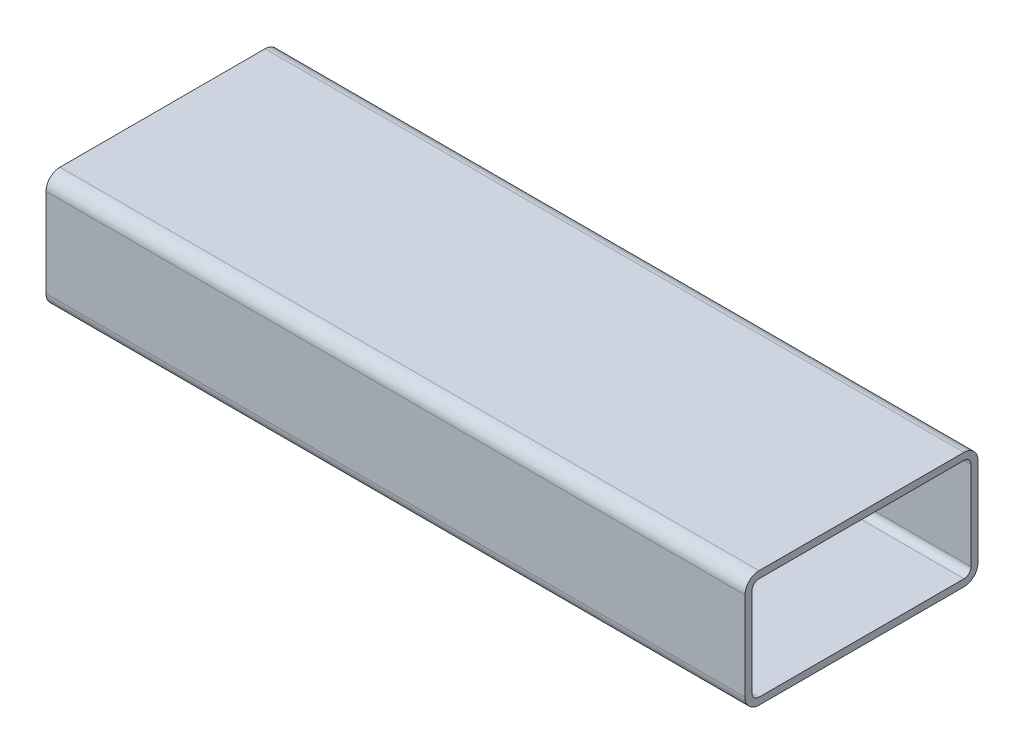
ISO-10303-21;
HEADER;
FILE_DESCRIPTION(('STEP AP214'),'2;1');
FILE_NAME('part.step','',(''),(''),'','','');
FILE_SCHEMA(('AUTOMOTIVE_DESIGN { 1 0 10303 214 1 1 1 1 }'));
ENDSEC;
DATA;
#1=APPLICATION_CONTEXT('core data for automotive mechanical design processes');
#2=APPLICATION_PROTOCOL_DEFINITION('international standard','automotive_design',2000,#1);
#3=PRODUCT_CONTEXT('',#1,'mechanical');
#4=PRODUCT('Part','Part','',(#3));
#5=PRODUCT_RELATED_PRODUCT_CATEGORY('part','',(#4));
#6=PRODUCT_DEFINITION_FORMATION('','',#4);
#7=PRODUCT_DEFINITION_CONTEXT('part definition',#1,'design');
#8=PRODUCT_DEFINITION('design','',#6,#7);
#9=PRODUCT_DEFINITION_SHAPE('','',#8);
#10=(LENGTH_UNIT() NAMED_UNIT(*) SI_UNIT(.MILLI.,.METRE.));
#11=(NAMED_UNIT(*) PLANE_ANGLE_UNIT() SI_UNIT($,.RADIAN.));
#12=(NAMED_UNIT(*) SI_UNIT($,.STERADIAN.) SOLID_ANGLE_UNIT());
#13=UNCERTAINTY_MEASURE_WITH_UNIT(LENGTH_MEASURE(1.E-05),#10,'distance_accuracy_value','');
#14=(GEOMETRIC_REPRESENTATION_CONTEXT(3) GLOBAL_UNCERTAINTY_ASSIGNED_CONTEXT((#13)) GLOBAL_UNIT_ASSIGNED_CONTEXT((#10,
#11,#12)) REPRESENTATION_CONTEXT('',''));
#15=CARTESIAN_POINT('',(0.,0.,0.));
#16=DIRECTION('',(0.,0.,1.));
#17=DIRECTION('',(1.,0.,0.));
#18=AXIS2_PLACEMENT_3D('',#15,#16,#17);
#19=CARTESIAN_POINT('',(152.4,9.652,-22.352));
#20=DIRECTION('',(-1.,0.,0.));
#21=DIRECTION('',(0.,0.,1.));
#22=AXIS2_PLACEMENT_3D('',#19,#20,#21);
#23=CYLINDRICAL_SURFACE('',#22,3.048);
#24=CARTESIAN_POINT('',(0.,9.652,-22.352));
#25=DIRECTION('',(1.,0.,0.));
#26=DIRECTION('',(0.,0.,-1.));
#27=AXIS2_PLACEMENT_3D('',#24,#25,#26);
#28=CIRCLE('',#27,3.048);
#29=CARTESIAN_POINT('',(0.,9.65199999999999,-25.4));
#30=VERTEX_POINT('',#29);
#31=CARTESIAN_POINT('',(0.,12.7,-22.352));
#32=VERTEX_POINT('',#31);
#33=EDGE_CURVE('E11',#30,#32,#28,.T.);
#34=ORIENTED_EDGE('',*,*,#33,.T.);
#35=DIRECTION('',(-1.,0.,0.));
#36=VECTOR('',#35,1.);
#37=CARTESIAN_POINT('',(152.4,12.7,-22.352));
#38=LINE('',#37,#36);
#39=CARTESIAN_POINT('',(152.4,12.7,-22.352));
#40=VERTEX_POINT('',#39);
#41=EDGE_CURVE('E40',#40,#32,#38,.T.);
#42=ORIENTED_EDGE('',*,*,#41,.F.);
#43=CARTESIAN_POINT('',(152.4,9.652,-22.352));
#44=DIRECTION('',(1.,0.,0.));
#45=DIRECTION('',(0.,0.,-1.));
#46=AXIS2_PLACEMENT_3D('',#43,#44,#45);
#47=CIRCLE('',#46,3.048);
#48=CARTESIAN_POINT('',(152.4,9.65199999999999,-25.4));
#49=VERTEX_POINT('',#48);
#50=EDGE_CURVE('E403',#49,#40,#47,.T.);
#51=ORIENTED_EDGE('',*,*,#50,.F.);
#52=DIRECTION('',(-1.,0.,0.));
#53=VECTOR('',#52,1.);
#54=CARTESIAN_POINT('',(152.4,9.65199999999999,-25.4));
#55=LINE('',#54,#53);
#56=EDGE_CURVE('E31',#49,#30,#55,.T.);
#57=ORIENTED_EDGE('',*,*,#56,.T.);
#58=EDGE_LOOP('',(#34,#42,#51,#57));
#59=FACE_BOUND('',#58,.T.);
#60=ADVANCED_FACE('F19',(#59),#23,.T.);
#61=CARTESIAN_POINT('',(152.4,12.7,22.352));
#62=DIRECTION('',(0.,-1.,0.));
#63=DIRECTION('',(0.,0.,-1.));
#64=AXIS2_PLACEMENT_3D('',#61,#62,#63);
#65=PLANE('',#64);
#66=DIRECTION('',(0.,0.,1.));
#67=VECTOR('',#66,1.);
#68=CARTESIAN_POINT('',(0.,12.7,22.352));
#69=LINE('',#68,#67);
#70=CARTESIAN_POINT('',(0.,12.7,22.352));
#71=VERTEX_POINT('',#70);
#72=EDGE_CURVE('E472',#32,#71,#69,.T.);
#73=ORIENTED_EDGE('',*,*,#72,.T.);
#74=DIRECTION('',(-1.,0.,0.));
#75=VECTOR('',#74,1.);
#76=CARTESIAN_POINT('',(152.4,12.7,22.352));
#77=LINE('',#76,#75);
#78=CARTESIAN_POINT('',(152.4,12.7,22.352));
#79=VERTEX_POINT('',#78);
#80=EDGE_CURVE('E404',#79,#71,#77,.T.);
#81=ORIENTED_EDGE('',*,*,#80,.F.);
#82=DIRECTION('',(0.,0.,1.));
#83=VECTOR('',#82,1.);
#84=CARTESIAN_POINT('',(152.4,12.7,22.352));
#85=LINE('',#84,#83);
#86=EDGE_CURVE('E388',#40,#79,#85,.T.);
#87=ORIENTED_EDGE('',*,*,#86,.F.);
#88=ORIENTED_EDGE('',*,*,#41,.T.);
#89=EDGE_LOOP('',(#73,#81,#87,#88));
#90=FACE_BOUND('',#89,.T.);
#91=ADVANCED_FACE('F550',(#90),#65,.F.);
#92=CARTESIAN_POINT('',(152.4,9.652,22.352));
#93=DIRECTION('',(-1.,0.,0.));
#94=DIRECTION('',(0.,0.,1.));
#95=AXIS2_PLACEMENT_3D('',#92,#93,#94);
#96=CYLINDRICAL_SURFACE('',#95,3.048);
#97=CARTESIAN_POINT('',(0.,9.652,22.352));
#98=DIRECTION('',(1.,0.,0.));
#99=DIRECTION('',(0.,0.,-1.));
#100=AXIS2_PLACEMENT_3D('',#97,#98,#99);
#101=CIRCLE('',#100,3.048);
#102=CARTESIAN_POINT('',(0.,9.65199999999999,25.4));
#103=VERTEX_POINT('',#102);
#104=EDGE_CURVE('E407',#71,#103,#101,.T.);
#105=ORIENTED_EDGE('',*,*,#104,.T.);
#106=DIRECTION('',(-1.,0.,0.));
#107=VECTOR('',#106,1.);
#108=CARTESIAN_POINT('',(152.4,9.65199999999999,25.4));
#109=LINE('',#108,#107);
#110=CARTESIAN_POINT('',(152.4,9.65199999999999,25.4));
#111=VERTEX_POINT('',#110);
#112=EDGE_CURVE('E389',#111,#103,#109,.T.);
#113=ORIENTED_EDGE('',*,*,#112,.F.);
#114=CARTESIAN_POINT('',(152.4,9.652,22.352));
#115=DIRECTION('',(1.,0.,0.));
#116=DIRECTION('',(0.,0.,-1.));
#117=AXIS2_PLACEMENT_3D('',#114,#115,#116);
#118=CIRCLE('',#117,3.048);
#119=EDGE_CURVE('E373',#79,#111,#118,.T.);
#120=ORIENTED_EDGE('',*,*,#119,.F.);
#121=ORIENTED_EDGE('',*,*,#80,.T.);
#122=EDGE_LOOP('',(#105,#113,#120,#121));
#123=FACE_BOUND('',#122,.T.);
#124=ADVANCED_FACE('F547',(#123),#96,.T.);
#125=CARTESIAN_POINT('',(152.4,9.65199999999999,25.4));
#126=DIRECTION('',(0.,0.,-1.));
#127=DIRECTION('',(0.,1.,0.));
#128=AXIS2_PLACEMENT_3D('',#125,#126,#127);
#129=PLANE('',#128);
#130=DIRECTION('',(0.,-1.,0.));
#131=VECTOR('',#130,1.);
#132=CARTESIAN_POINT('',(0.,9.65199999999999,25.4));
#133=LINE('',#132,#131);
#134=CARTESIAN_POINT('',(0.,-9.652,25.4));
#135=VERTEX_POINT('',#134);
#136=EDGE_CURVE('E391',#103,#135,#133,.T.);
#137=ORIENTED_EDGE('',*,*,#136,.T.);
#138=DIRECTION('',(-1.,0.,0.));
#139=VECTOR('',#138,1.);
#140=CARTESIAN_POINT('',(152.4,-9.652,25.4));
#141=LINE('',#140,#139);
#142=CARTESIAN_POINT('',(152.4,-9.652,25.4));
#143=VERTEX_POINT('',#142);
#144=EDGE_CURVE('E374',#143,#135,#141,.T.);
#145=ORIENTED_EDGE('',*,*,#144,.F.);
#146=DIRECTION('',(0.,-1.,0.));
#147=VECTOR('',#146,1.);
#148=CARTESIAN_POINT('',(152.4,9.65199999999999,25.4));
#149=LINE('',#148,#147);
#150=EDGE_CURVE('E357',#111,#143,#149,.T.);
#151=ORIENTED_EDGE('',*,*,#150,.F.);
#152=ORIENTED_EDGE('',*,*,#112,.T.);
#153=EDGE_LOOP('',(#137,#145,#151,#152));
#154=FACE_BOUND('',#153,.T.);
#155=ADVANCED_FACE('F539',(#154),#129,.F.);
#156=CARTESIAN_POINT('',(152.4,-9.652,22.352));
#157=DIRECTION('',(-1.,0.,0.));
#158=DIRECTION('',(0.,0.,1.));
#159=AXIS2_PLACEMENT_3D('',#156,#157,#158);
#160=CYLINDRICAL_SURFACE('',#159,3.048);
#161=CARTESIAN_POINT('',(0.,-9.652,22.352));
#162=DIRECTION('',(1.,0.,0.));
#163=DIRECTION('',(0.,0.,1.));
#164=AXIS2_PLACEMENT_3D('',#161,#162,#163);
#165=CIRCLE('',#164,3.048);
#166=CARTESIAN_POINT('',(0.,-12.7,22.352));
#167=VERTEX_POINT('',#166);
#168=EDGE_CURVE('E376',#135,#167,#165,.T.);
#169=ORIENTED_EDGE('',*,*,#168,.T.);
#170=DIRECTION('',(-1.,0.,0.));
#171=VECTOR('',#170,1.);
#172=CARTESIAN_POINT('',(152.4,-12.7,22.352));
#173=LINE('',#172,#171);
#174=CARTESIAN_POINT('',(152.4,-12.7,22.352));
#175=VERTEX_POINT('',#174);
#176=EDGE_CURVE('E358',#175,#167,#173,.T.);
#177=ORIENTED_EDGE('',*,*,#176,.F.);
#178=CARTESIAN_POINT('',(152.4,-9.652,22.352));
#179=DIRECTION('',(1.,0.,0.));
#180=DIRECTION('',(0.,0.,1.));
#181=AXIS2_PLACEMENT_3D('',#178,#179,#180);
#182=CIRCLE('',#181,3.048);
#183=EDGE_CURVE('E338',#143,#175,#182,.T.);
#184=ORIENTED_EDGE('',*,*,#183,.F.);
#185=ORIENTED_EDGE('',*,*,#144,.T.);
#186=EDGE_LOOP('',(#169,#177,#184,#185));
#187=FACE_BOUND('',#186,.T.);
#188=ADVANCED_FACE('F537',(#187),#160,.T.);
#189=CARTESIAN_POINT('',(152.4,-12.7,22.352));
#190=DIRECTION('',(0.,1.,0.));
#191=DIRECTION('',(0.,0.,1.));
#192=AXIS2_PLACEMENT_3D('',#189,#190,#191);
#193=PLANE('',#192);
#194=DIRECTION('',(0.,0.,-1.));
#195=VECTOR('',#194,1.);
#196=CARTESIAN_POINT('',(0.,-12.7,22.352));
#197=LINE('',#196,#195);
#198=CARTESIAN_POINT('',(0.,-12.7,-22.352));
#199=VERTEX_POINT('',#198);
#200=EDGE_CURVE('E360',#167,#199,#197,.T.);
#201=ORIENTED_EDGE('',*,*,#200,.T.);
#202=DIRECTION('',(-1.,0.,0.));
#203=VECTOR('',#202,1.);
#204=CARTESIAN_POINT('',(152.4,-12.7,-22.352));
#205=LINE('',#204,#203);
#206=CARTESIAN_POINT('',(152.4,-12.7,-22.352));
#207=VERTEX_POINT('',#206);
#208=EDGE_CURVE('E293',#207,#199,#205,.T.);
#209=ORIENTED_EDGE('',*,*,#208,.F.);
#210=DIRECTION('',(0.,0.,-1.));
#211=VECTOR('',#210,1.);
#212=CARTESIAN_POINT('',(152.4,-12.7,22.352));
#213=LINE('',#212,#211);
#214=EDGE_CURVE('E307',#175,#207,#213,.T.);
#215=ORIENTED_EDGE('',*,*,#214,.F.);
#216=ORIENTED_EDGE('',*,*,#176,.T.);
#217=EDGE_LOOP('',(#201,#209,#215,#216));
#218=FACE_BOUND('',#217,.T.);
#219=ADVANCED_FACE('F535',(#218),#193,.F.);
#220=CARTESIAN_POINT('',(152.4,-9.652,-22.352));
#221=DIRECTION('',(-1.,0.,0.));
#222=DIRECTION('',(0.,0.,1.));
#223=AXIS2_PLACEMENT_3D('',#220,#221,#222);
#224=CYLINDRICAL_SURFACE('',#223,3.048);
#225=CARTESIAN_POINT('',(0.,-9.652,-22.352));
#226=DIRECTION('',(1.,0.,0.));
#227=DIRECTION('',(0.,0.,-1.));
#228=AXIS2_PLACEMENT_3D('',#225,#226,#227);
#229=CIRCLE('',#228,3.048);
#230=CARTESIAN_POINT('',(0.,-9.65199999999999,-25.4));
#231=VERTEX_POINT('',#230);
#232=EDGE_CURVE('E341',#199,#231,#229,.T.);
#233=ORIENTED_EDGE('',*,*,#232,.T.);
#234=DIRECTION('',(-1.,0.,0.));
#235=VECTOR('',#234,1.);
#236=CARTESIAN_POINT('',(152.4,-9.65199999999999,-25.4));
#237=LINE('',#236,#235);
#238=CARTESIAN_POINT('',(152.4,-9.65199999999999,-25.4));
#239=VERTEX_POINT('',#238);
#240=EDGE_CURVE('E308',#239,#231,#237,.T.);
#241=ORIENTED_EDGE('',*,*,#240,.F.);
#242=CARTESIAN_POINT('',(152.4,-9.652,-22.352));
#243=DIRECTION('',(1.,0.,0.));
#244=DIRECTION('',(0.,0.,-1.));
#245=AXIS2_PLACEMENT_3D('',#242,#243,#244);
#246=CIRCLE('',#245,3.048);
#247=EDGE_CURVE('E303',#207,#239,#246,.T.);
#248=ORIENTED_EDGE('',*,*,#247,.F.);
#249=ORIENTED_EDGE('',*,*,#208,.T.);
#250=EDGE_LOOP('',(#233,#241,#248,#249));
#251=FACE_BOUND('',#250,.T.);
#252=ADVANCED_FACE('F534',(#251),#224,.T.);
#253=CARTESIAN_POINT('',(152.4,9.652,-22.352));
#254=DIRECTION('',(-1.,0.,0.));
#255=DIRECTION('',(0.,0.,1.));
#256=AXIS2_PLACEMENT_3D('',#253,#254,#255);
#257=CYLINDRICAL_SURFACE('',#256,1.524);
#258=CARTESIAN_POINT('',(0.,9.652,-22.352));
#259=DIRECTION('',(1.,0.,0.));
#260=DIRECTION('',(0.,0.,-1.));
#261=AXIS2_PLACEMENT_3D('',#258,#259,#260);
#262=CIRCLE('',#261,1.524);
#263=CARTESIAN_POINT('',(0.,9.65199999999999,-23.876));
#264=VERTEX_POINT('',#263);
#265=CARTESIAN_POINT('',(0.,11.176,-22.352));
#266=VERTEX_POINT('',#265);
#267=EDGE_CURVE('E310',#264,#266,#262,.T.);
#268=ORIENTED_EDGE('',*,*,#267,.F.);
#269=DIRECTION('',(-1.,0.,0.));
#270=VECTOR('',#269,1.);
#271=CARTESIAN_POINT('',(152.4,9.65199999999999,-23.876));
#272=LINE('',#271,#270);
#273=CARTESIAN_POINT('',(152.4,9.65199999999999,-23.876));
#274=VERTEX_POINT('',#273);
#275=EDGE_CURVE('E261',#274,#264,#272,.T.);
#276=ORIENTED_EDGE('',*,*,#275,.F.);
#277=CARTESIAN_POINT('',(152.4,9.652,-22.352));
#278=DIRECTION('',(1.,0.,0.));
#279=DIRECTION('',(0.,0.,-1.));
#280=AXIS2_PLACEMENT_3D('',#277,#278,#279);
#281=CIRCLE('',#280,1.524);
#282=CARTESIAN_POINT('',(152.4,11.176,-22.352));
#283=VERTEX_POINT('',#282);
#284=EDGE_CURVE('E288',#274,#283,#281,.T.);
#285=ORIENTED_EDGE('',*,*,#284,.T.);
#286=DIRECTION('',(-1.,0.,0.));
#287=VECTOR('',#286,1.);
#288=CARTESIAN_POINT('',(152.4,11.176,-22.352));
#289=LINE('',#288,#287);
#290=EDGE_CURVE('E162',#283,#266,#289,.T.);
#291=ORIENTED_EDGE('',*,*,#290,.T.);
#292=EDGE_LOOP('',(#268,#276,#285,#291));
#293=FACE_BOUND('',#292,.T.);
#294=ADVANCED_FACE('F591',(#293),#257,.F.);
#295=CARTESIAN_POINT('',(152.4,9.65199999999999,-23.876));
#296=DIRECTION('',(0.,0.,1.));
#297=DIRECTION('',(1.,0.,0.));
#298=AXIS2_PLACEMENT_3D('',#295,#296,#297);
#299=PLANE('',#298);
#300=DIRECTION('',(0.,1.,0.));
#301=VECTOR('',#300,1.);
#302=CARTESIAN_POINT('',(0.,9.65199999999999,-23.876));
#303=LINE('',#302,#301);
#304=CARTESIAN_POINT('',(0.,-9.65199999999999,-23.876));
#305=VERTEX_POINT('',#304);
#306=EDGE_CURVE('E787',#305,#264,#303,.T.);
#307=ORIENTED_EDGE('',*,*,#306,.F.);
#308=DIRECTION('',(-1.,0.,0.));
#309=VECTOR('',#308,1.);
#310=CARTESIAN_POINT('',(152.4,-9.65199999999999,-23.876));
#311=LINE('',#310,#309);
#312=CARTESIAN_POINT('',(152.4,-9.65199999999999,-23.876));
#313=VERTEX_POINT('',#312);
#314=EDGE_CURVE('E242',#313,#305,#311,.T.);
#315=ORIENTED_EDGE('',*,*,#314,.F.);
#316=DIRECTION('',(0.,1.,0.));
#317=VECTOR('',#316,1.);
#318=CARTESIAN_POINT('',(152.4,9.65199999999999,-23.876));
#319=LINE('',#318,#317);
#320=EDGE_CURVE('E273',#313,#274,#319,.T.);
#321=ORIENTED_EDGE('',*,*,#320,.T.);
#322=ORIENTED_EDGE('',*,*,#275,.T.);
#323=EDGE_LOOP('',(#307,#315,#321,#322));
#324=FACE_BOUND('',#323,.T.);
#325=ADVANCED_FACE('F600',(#324),#299,.T.);
#326=CARTESIAN_POINT('',(152.4,-9.652,-22.352));
#327=DIRECTION('',(-1.,0.,0.));
#328=DIRECTION('',(0.,0.,1.));
#329=AXIS2_PLACEMENT_3D('',#326,#327,#328);
#330=CYLINDRICAL_SURFACE('',#329,1.524);
#331=CARTESIAN_POINT('',(0.,-9.652,-22.352));
#332=DIRECTION('',(1.,0.,0.));
#333=DIRECTION('',(0.,0.,-1.));
#334=AXIS2_PLACEMENT_3D('',#331,#332,#333);
#335=CIRCLE('',#334,1.524);
#336=CARTESIAN_POINT('',(0.,-11.176,-22.352));
#337=VERTEX_POINT('',#336);
#338=EDGE_CURVE('E279',#337,#305,#335,.T.);
#339=ORIENTED_EDGE('',*,*,#338,.F.);
#340=DIRECTION('',(-1.,0.,0.));
#341=VECTOR('',#340,1.);
#342=CARTESIAN_POINT('',(152.4,-11.176,-22.352));
#343=LINE('',#342,#341);
#344=CARTESIAN_POINT('',(152.4,-11.176,-22.352));
#345=VERTEX_POINT('',#344);
#346=EDGE_CURVE('E226',#345,#337,#343,.T.);
#347=ORIENTED_EDGE('',*,*,#346,.F.);
#348=CARTESIAN_POINT('',(152.4,-9.652,-22.352));
#349=DIRECTION('',(1.,0.,0.));
#350=DIRECTION('',(0.,0.,-1.));
#351=AXIS2_PLACEMENT_3D('',#348,#349,#350);
#352=CIRCLE('',#351,1.524);
#353=EDGE_CURVE('E256',#345,#313,#352,.T.);
#354=ORIENTED_EDGE('',*,*,#353,.T.);
#355=ORIENTED_EDGE('',*,*,#314,.T.);
#356=EDGE_LOOP('',(#339,#347,#354,#355));
#357=FACE_BOUND('',#356,.T.);
#358=ADVANCED_FACE('F610',(#357),#330,.F.);
#359=CARTESIAN_POINT('',(152.4,-11.176,22.352));
#360=DIRECTION('',(0.,1.,0.));
#361=DIRECTION('',(0.,0.,1.));
#362=AXIS2_PLACEMENT_3D('',#359,#360,#361);
#363=PLANE('',#362);
#364=DIRECTION('',(0.,0.,-1.));
#365=VECTOR('',#364,1.);
#366=CARTESIAN_POINT('',(0.,-11.176,22.352));
#367=LINE('',#366,#365);
#368=CARTESIAN_POINT('',(0.,-11.176,22.352));
#369=VERTEX_POINT('',#368);
#370=EDGE_CURVE('E263',#369,#337,#367,.T.);
#371=ORIENTED_EDGE('',*,*,#370,.F.);
#372=DIRECTION('',(-1.,0.,0.));
#373=VECTOR('',#372,1.);
#374=CARTESIAN_POINT('',(152.4,-11.176,22.352));
#375=LINE('',#374,#373);
#376=CARTESIAN_POINT('',(152.4,-11.176,22.352));
#377=VERTEX_POINT('',#376);
#378=EDGE_CURVE('E210',#377,#369,#375,.T.);
#379=ORIENTED_EDGE('',*,*,#378,.F.);
#380=DIRECTION('',(0.,0.,-1.));
#381=VECTOR('',#380,1.);
#382=CARTESIAN_POINT('',(152.4,-11.176,22.352));
#383=LINE('',#382,#381);
#384=EDGE_CURVE('E237',#377,#345,#383,.T.);
#385=ORIENTED_EDGE('',*,*,#384,.T.);
#386=ORIENTED_EDGE('',*,*,#346,.T.);
#387=EDGE_LOOP('',(#371,#379,#385,#386));
#388=FACE_BOUND('',#387,.T.);
#389=ADVANCED_FACE('F620',(#388),#363,.T.);
#390=CARTESIAN_POINT('',(152.4,-9.652,22.352));
#391=DIRECTION('',(-1.,0.,0.));
#392=DIRECTION('',(0.,0.,1.));
#393=AXIS2_PLACEMENT_3D('',#390,#391,#392);
#394=CYLINDRICAL_SURFACE('',#393,1.524);
#395=CARTESIAN_POINT('',(0.,-9.652,22.352));
#396=DIRECTION('',(1.,0.,0.));
#397=DIRECTION('',(0.,0.,1.));
#398=AXIS2_PLACEMENT_3D('',#395,#396,#397);
#399=CIRCLE('',#398,1.524);
#400=CARTESIAN_POINT('',(0.,-9.652,23.876));
#401=VERTEX_POINT('',#400);
#402=EDGE_CURVE('E244',#401,#369,#399,.T.);
#403=ORIENTED_EDGE('',*,*,#402,.F.);
#404=DIRECTION('',(-1.,0.,0.));
#405=VECTOR('',#404,1.);
#406=CARTESIAN_POINT('',(152.4,-9.652,23.876));
#407=LINE('',#406,#405);
#408=CARTESIAN_POINT('',(152.4,-9.652,23.876));
#409=VERTEX_POINT('',#408);
#410=EDGE_CURVE('E157',#409,#401,#407,.T.);
#411=ORIENTED_EDGE('',*,*,#410,.F.);
#412=CARTESIAN_POINT('',(152.4,-9.652,22.352));
#413=DIRECTION('',(1.,0.,0.));
#414=DIRECTION('',(0.,0.,1.));
#415=AXIS2_PLACEMENT_3D('',#412,#413,#414);
#416=CIRCLE('',#415,1.524);
#417=EDGE_CURVE('E221',#409,#377,#416,.T.);
#418=ORIENTED_EDGE('',*,*,#417,.T.);
#419=ORIENTED_EDGE('',*,*,#378,.T.);
#420=EDGE_LOOP('',(#403,#411,#418,#419));
#421=FACE_BOUND('',#420,.T.);
#422=ADVANCED_FACE('F630',(#421),#394,.F.);
#423=CARTESIAN_POINT('',(152.4,9.65199999999999,23.876));
#424=DIRECTION('',(0.,0.,-1.));
#425=DIRECTION('',(0.,1.,0.));
#426=AXIS2_PLACEMENT_3D('',#423,#424,#425);
#427=PLANE('',#426);
#428=DIRECTION('',(0.,-1.,0.));
#429=VECTOR('',#428,1.);
#430=CARTESIAN_POINT('',(0.,9.65199999999999,23.876));
#431=LINE('',#430,#429);
#432=CARTESIAN_POINT('',(0.,9.65199999999999,23.876));
#433=VERTEX_POINT('',#432);
#434=EDGE_CURVE('E228',#433,#401,#431,.T.);
#435=ORIENTED_EDGE('',*,*,#434,.F.);
#436=DIRECTION('',(-1.,0.,0.));
#437=VECTOR('',#436,1.);
#438=CARTESIAN_POINT('',(152.4,9.65199999999999,23.876));
#439=LINE('',#438,#437);
#440=CARTESIAN_POINT('',(152.4,9.65199999999999,23.876));
#441=VERTEX_POINT('',#440);
#442=EDGE_CURVE('E158',#441,#433,#439,.T.);
#443=ORIENTED_EDGE('',*,*,#442,.F.);
#444=DIRECTION('',(0.,-1.,0.));
#445=VECTOR('',#444,1.);
#446=CARTESIAN_POINT('',(152.4,9.65199999999999,23.876));
#447=LINE('',#446,#445);
#448=EDGE_CURVE('E155',#441,#409,#447,.T.);
#449=ORIENTED_EDGE('',*,*,#448,.T.);
#450=ORIENTED_EDGE('',*,*,#410,.T.);
#451=EDGE_LOOP('',(#435,#443,#449,#450));
#452=FACE_BOUND('',#451,.T.);
#453=ADVANCED_FACE('F640',(#452),#427,.T.);
#454=CARTESIAN_POINT('',(152.4,9.652,22.352));
#455=DIRECTION('',(-1.,0.,0.));
#456=DIRECTION('',(0.,0.,1.));
#457=AXIS2_PLACEMENT_3D('',#454,#455,#456);
#458=CYLINDRICAL_SURFACE('',#457,1.524);
#459=CARTESIAN_POINT('',(0.,9.652,22.352));
#460=DIRECTION('',(1.,0.,0.));
#461=DIRECTION('',(0.,0.,-1.));
#462=AXIS2_PLACEMENT_3D('',#459,#460,#461);
#463=CIRCLE('',#462,1.524);
#464=CARTESIAN_POINT('',(0.,11.176,22.352));
#465=VERTEX_POINT('',#464);
#466=EDGE_CURVE('E132',#465,#433,#463,.T.);
#467=ORIENTED_EDGE('',*,*,#466,.F.);
#468=DIRECTION('',(-1.,0.,0.));
#469=VECTOR('',#468,1.);
#470=CARTESIAN_POINT('',(152.4,11.176,22.352));
#471=LINE('',#470,#469);
#472=CARTESIAN_POINT('',(152.4,11.176,22.352));
#473=VERTEX_POINT('',#472);
#474=EDGE_CURVE('E135',#473,#465,#471,.T.);
#475=ORIENTED_EDGE('',*,*,#474,.F.);
#476=CARTESIAN_POINT('',(152.4,9.652,22.352));
#477=DIRECTION('',(1.,0.,0.));
#478=DIRECTION('',(0.,0.,-1.));
#479=AXIS2_PLACEMENT_3D('',#476,#477,#478);
#480=CIRCLE('',#479,1.524);
#481=EDGE_CURVE('E138',#473,#441,#480,.T.);
#482=ORIENTED_EDGE('',*,*,#481,.T.);
#483=ORIENTED_EDGE('',*,*,#442,.T.);
#484=EDGE_LOOP('',(#467,#475,#482,#483));
#485=FACE_BOUND('',#484,.T.);
#486=ADVANCED_FACE('F137',(#485),#458,.F.);
#487=CARTESIAN_POINT('',(152.4,11.176,22.352));
#488=DIRECTION('',(0.,-1.,0.));
#489=DIRECTION('',(0.,0.,-1.));
#490=AXIS2_PLACEMENT_3D('',#487,#488,#489);
#491=PLANE('',#490);
#492=DIRECTION('',(0.,0.,1.));
#493=VECTOR('',#492,1.);
#494=CARTESIAN_POINT('',(0.,11.176,22.352));
#495=LINE('',#494,#493);
#496=EDGE_CURVE('E173',#266,#465,#495,.T.);
#497=ORIENTED_EDGE('',*,*,#496,.F.);
#498=ORIENTED_EDGE('',*,*,#290,.F.);
#499=DIRECTION('',(0.,0.,1.));
#500=VECTOR('',#499,1.);
#501=CARTESIAN_POINT('',(152.4,11.176,22.352));
#502=LINE('',#501,#500);
#503=EDGE_CURVE('E144',#283,#473,#502,.T.);
#504=ORIENTED_EDGE('',*,*,#503,.T.);
#505=ORIENTED_EDGE('',*,*,#474,.T.);
#506=EDGE_LOOP('',(#497,#498,#504,#505));
#507=FACE_BOUND('',#506,.T.);
#508=ADVANCED_FACE('F160',(#507),#491,.T.);
#509=CARTESIAN_POINT('',(152.4,9.65199999999999,-25.4));
#510=DIRECTION('',(0.,0.,1.));
#511=DIRECTION('',(1.,0.,0.));
#512=AXIS2_PLACEMENT_3D('',#509,#510,#511);
#513=PLANE('',#512);
#514=DIRECTION('',(0.,1.,0.));
#515=VECTOR('',#514,1.);
#516=CARTESIAN_POINT('',(0.,9.65199999999999,-25.4));
#517=LINE('',#516,#515);
#518=EDGE_CURVE('E145',#231,#30,#517,.T.);
#519=ORIENTED_EDGE('',*,*,#518,.T.);
#520=ORIENTED_EDGE('',*,*,#56,.F.);
#521=DIRECTION('',(0.,1.,0.));
#522=VECTOR('',#521,1.);
#523=CARTESIAN_POINT('',(152.4,9.65199999999999,-25.4));
#524=LINE('',#523,#522);
#525=EDGE_CURVE('E23',#239,#49,#524,.T.);
#526=ORIENTED_EDGE('',*,*,#525,.F.);
#527=ORIENTED_EDGE('',*,*,#240,.T.);
#528=EDGE_LOOP('',(#519,#520,#526,#527));
#529=FACE_BOUND('',#528,.T.);
#530=ADVANCED_FACE('F667',(#529),#513,.F.);
#531=CARTESIAN_POINT('',(152.4,9.652,-22.352));
#532=DIRECTION('',(1.,0.,0.));
#533=DIRECTION('',(0.,0.,-1.));
#534=AXIS2_PLACEMENT_3D('',#531,#532,#533);
#535=PLANE('',#534);
#536=ORIENTED_EDGE('',*,*,#284,.F.);
#537=ORIENTED_EDGE('',*,*,#320,.F.);
#538=ORIENTED_EDGE('',*,*,#353,.F.);
#539=ORIENTED_EDGE('',*,*,#384,.F.);
#540=ORIENTED_EDGE('',*,*,#417,.F.);
#541=ORIENTED_EDGE('',*,*,#448,.F.);
#542=ORIENTED_EDGE('',*,*,#481,.F.);
#543=ORIENTED_EDGE('',*,*,#503,.F.);
#544=EDGE_LOOP('',(#536,#537,#538,#539,#540,#541,#542,#543));
#545=FACE_BOUND('',#544,.T.);
#546=ORIENTED_EDGE('',*,*,#50,.T.);
#547=ORIENTED_EDGE('',*,*,#86,.T.);
#548=ORIENTED_EDGE('',*,*,#119,.T.);
#549=ORIENTED_EDGE('',*,*,#150,.T.);
#550=ORIENTED_EDGE('',*,*,#183,.T.);
#551=ORIENTED_EDGE('',*,*,#214,.T.);
#552=ORIENTED_EDGE('',*,*,#247,.T.);
#553=ORIENTED_EDGE('',*,*,#525,.T.);
#554=EDGE_LOOP('',(#546,#547,#548,#549,#550,#551,#552,#553));
#555=FACE_BOUND('',#554,.T.);
#556=ADVANCED_FACE('F151',(#545,#555),#535,.T.);
#557=CARTESIAN_POINT('',(0.,9.652,-22.352));
#558=DIRECTION('',(1.,0.,0.));
#559=DIRECTION('',(0.,0.,-1.));
#560=AXIS2_PLACEMENT_3D('',#557,#558,#559);
#561=PLANE('',#560);
#562=ORIENTED_EDGE('',*,*,#267,.T.);
#563=ORIENTED_EDGE('',*,*,#496,.T.);
#564=ORIENTED_EDGE('',*,*,#466,.T.);
#565=ORIENTED_EDGE('',*,*,#434,.T.);
#566=ORIENTED_EDGE('',*,*,#402,.T.);
#567=ORIENTED_EDGE('',*,*,#370,.T.);
#568=ORIENTED_EDGE('',*,*,#338,.T.);
#569=ORIENTED_EDGE('',*,*,#306,.T.);
#570=EDGE_LOOP('',(#562,#563,#564,#565,#566,#567,#568,#569));
#571=FACE_BOUND('',#570,.T.);
#572=ORIENTED_EDGE('',*,*,#33,.F.);
#573=ORIENTED_EDGE('',*,*,#518,.F.);
#574=ORIENTED_EDGE('',*,*,#232,.F.);
#575=ORIENTED_EDGE('',*,*,#200,.F.);
#576=ORIENTED_EDGE('',*,*,#168,.F.);
#577=ORIENTED_EDGE('',*,*,#136,.F.);
#578=ORIENTED_EDGE('',*,*,#104,.F.);
#579=ORIENTED_EDGE('',*,*,#72,.F.);
#580=EDGE_LOOP('',(#572,#573,#574,#575,#576,#577,#578,#579));
#581=FACE_BOUND('',#580,.T.);
#582=ADVANCED_FACE('F21',(#571,#581),#561,.F.);
#583=CLOSED_SHELL('',(#60,#91,#124,#155,#188,#219,#252,#294,#325,#358,#389,#422,#453,#486,#508,
#530,#556,#582));
#584=MANIFOLD_SOLID_BREP('B1',#583);
#585=ADVANCED_BREP_SHAPE_REPRESENTATION('',(#18,#584),#14);
#586=SHAPE_DEFINITION_REPRESENTATION(#9,#585);
ENDSEC;
END-ISO-10303-21;
